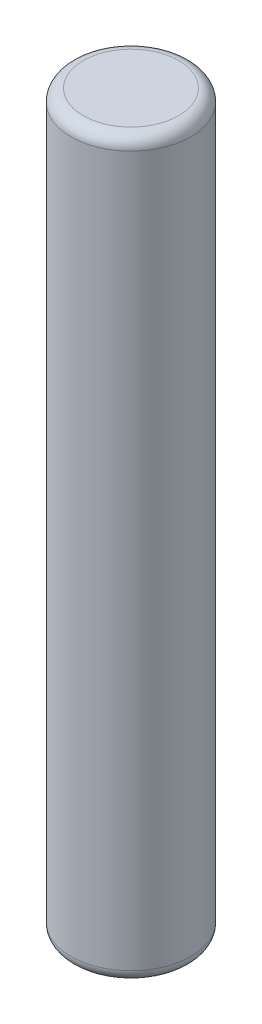
ISO-10303-21;
HEADER;
FILE_DESCRIPTION(('STEP AP214'),'2;1');
FILE_NAME('part.step','',(''),(''),'','','');
FILE_SCHEMA(('AUTOMOTIVE_DESIGN { 1 0 10303 214 1 1 1 1 }'));
ENDSEC;
DATA;
#1=APPLICATION_CONTEXT('core data for automotive mechanical design processes');
#2=APPLICATION_PROTOCOL_DEFINITION('international standard','automotive_design',2000,#1);
#3=PRODUCT_CONTEXT('',#1,'mechanical');
#4=PRODUCT('Part','Part','',(#3));
#5=PRODUCT_RELATED_PRODUCT_CATEGORY('part','',(#4));
#6=PRODUCT_DEFINITION_FORMATION('','',#4);
#7=PRODUCT_DEFINITION_CONTEXT('part definition',#1,'design');
#8=PRODUCT_DEFINITION('design','',#6,#7);
#9=PRODUCT_DEFINITION_SHAPE('','',#8);
#10=(LENGTH_UNIT() NAMED_UNIT(*) SI_UNIT(.MILLI.,.METRE.));
#11=(NAMED_UNIT(*) PLANE_ANGLE_UNIT() SI_UNIT($,.RADIAN.));
#12=(NAMED_UNIT(*) SI_UNIT($,.STERADIAN.) SOLID_ANGLE_UNIT());
#13=UNCERTAINTY_MEASURE_WITH_UNIT(LENGTH_MEASURE(1.E-05),#10,'distance_accuracy_value','');
#14=(GEOMETRIC_REPRESENTATION_CONTEXT(3) GLOBAL_UNCERTAINTY_ASSIGNED_CONTEXT((#13)) GLOBAL_UNIT_ASSIGNED_CONTEXT((#10,
#11,#12)) REPRESENTATION_CONTEXT('',''));
#15=CARTESIAN_POINT('',(0.,0.,0.));
#16=DIRECTION('',(0.,0.,1.));
#17=DIRECTION('',(1.,0.,0.));
#18=AXIS2_PLACEMENT_3D('',#15,#16,#17);
#19=CARTESIAN_POINT('',(0.,30.,0.));
#20=DIRECTION('',(0.,-1.,0.));
#21=DIRECTION('',(0.,0.,-1.));
#22=AXIS2_PLACEMENT_3D('',#19,#20,#21);
#23=CYLINDRICAL_SURFACE('',#22,2.45);
#24=CARTESIAN_POINT('',(0.,0.5,0.));
#25=DIRECTION('',(0.,1.,0.));
#26=DIRECTION('',(0.,0.,1.));
#27=AXIS2_PLACEMENT_3D('',#24,#25,#26);
#28=CIRCLE('',#27,2.45);
#29=CARTESIAN_POINT('',(0.,0.5,2.45));
#30=VERTEX_POINT('',#29);
#31=EDGE_CURVE('E50',#30,#30,#28,.T.);
#32=ORIENTED_EDGE('',*,*,#31,.T.);
#33=EDGE_LOOP('',(#32));
#34=FACE_BOUND('',#33,.T.);
#35=CARTESIAN_POINT('',(0.,29.5,0.));
#36=DIRECTION('',(0.,1.,0.));
#37=DIRECTION('',(0.,0.,1.));
#38=AXIS2_PLACEMENT_3D('',#35,#36,#37);
#39=CIRCLE('',#38,2.45);
#40=CARTESIAN_POINT('',(0.,29.5,2.45));
#41=VERTEX_POINT('',#40);
#42=EDGE_CURVE('E55',#41,#41,#39,.F.);
#43=ORIENTED_EDGE('',*,*,#42,.T.);
#44=EDGE_LOOP('',(#43));
#45=FACE_BOUND('',#44,.T.);
#46=ADVANCED_FACE('F37',(#34,#45),#23,.T.);
#47=CARTESIAN_POINT('',(0.,30.,0.));
#48=DIRECTION('',(0.,1.,0.));
#49=DIRECTION('',(0.,0.,1.));
#50=AXIS2_PLACEMENT_3D('',#47,#48,#49);
#51=PLANE('',#50);
#52=CARTESIAN_POINT('',(0.,30.,0.));
#53=DIRECTION('',(0.,1.,0.));
#54=DIRECTION('',(0.,0.,1.));
#55=AXIS2_PLACEMENT_3D('',#52,#53,#54);
#56=CIRCLE('',#55,1.95);
#57=CARTESIAN_POINT('',(0.,30.,1.95));
#58=VERTEX_POINT('',#57);
#59=EDGE_CURVE('E10',#58,#58,#56,.T.);
#60=ORIENTED_EDGE('',*,*,#59,.T.);
#61=EDGE_LOOP('',(#60));
#62=FACE_BOUND('',#61,.T.);
#63=ADVANCED_FACE('F72',(#62),#51,.T.);
#64=CARTESIAN_POINT('',(0.,0.,0.));
#65=DIRECTION('',(0.,1.,0.));
#66=DIRECTION('',(0.,0.,1.));
#67=AXIS2_PLACEMENT_3D('',#64,#65,#66);
#68=PLANE('',#67);
#69=CARTESIAN_POINT('',(0.,0.,0.));
#70=DIRECTION('',(0.,1.,0.));
#71=DIRECTION('',(0.,0.,1.));
#72=AXIS2_PLACEMENT_3D('',#69,#70,#71);
#73=CIRCLE('',#72,1.95);
#74=CARTESIAN_POINT('',(0.,0.,1.95));
#75=VERTEX_POINT('',#74);
#76=EDGE_CURVE('E45',#75,#75,#73,.F.);
#77=ORIENTED_EDGE('',*,*,#76,.T.);
#78=EDGE_LOOP('',(#77));
#79=FACE_BOUND('',#78,.T.);
#80=ADVANCED_FACE('F69',(#79),#68,.F.);
#81=CARTESIAN_POINT('',(0.,0.5,0.));
#82=DIRECTION('',(0.,1.,0.));
#83=DIRECTION('',(0.,0.,1.));
#84=AXIS2_PLACEMENT_3D('',#81,#82,#83);
#85=TOROIDAL_SURFACE('',#84,1.95,0.5);
#86=ORIENTED_EDGE('',*,*,#76,.F.);
#87=EDGE_LOOP('',(#86));
#88=FACE_BOUND('',#87,.T.);
#89=ORIENTED_EDGE('',*,*,#31,.F.);
#90=EDGE_LOOP('',(#89));
#91=FACE_BOUND('',#90,.T.);
#92=ADVANCED_FACE('F65',(#88,#91),#85,.T.);
#93=CARTESIAN_POINT('',(0.,29.5,0.));
#94=DIRECTION('',(0.,1.,0.));
#95=DIRECTION('',(0.,0.,1.));
#96=AXIS2_PLACEMENT_3D('',#93,#94,#95);
#97=TOROIDAL_SURFACE('',#96,1.95,0.5);
#98=ORIENTED_EDGE('',*,*,#42,.F.);
#99=EDGE_LOOP('',(#98));
#100=FACE_BOUND('',#99,.T.);
#101=ORIENTED_EDGE('',*,*,#59,.F.);
#102=EDGE_LOOP('',(#101));
#103=FACE_BOUND('',#102,.T.);
#104=ADVANCED_FACE('F39',(#100,#103),#97,.T.);
#105=CLOSED_SHELL('',(#46,#63,#80,#92,#104));
#106=MANIFOLD_SOLID_BREP('B2',#105);
#107=ADVANCED_BREP_SHAPE_REPRESENTATION('',(#18,#106),#14);
#108=SHAPE_DEFINITION_REPRESENTATION(#9,#107);
ENDSEC;
END-ISO-10303-21;
